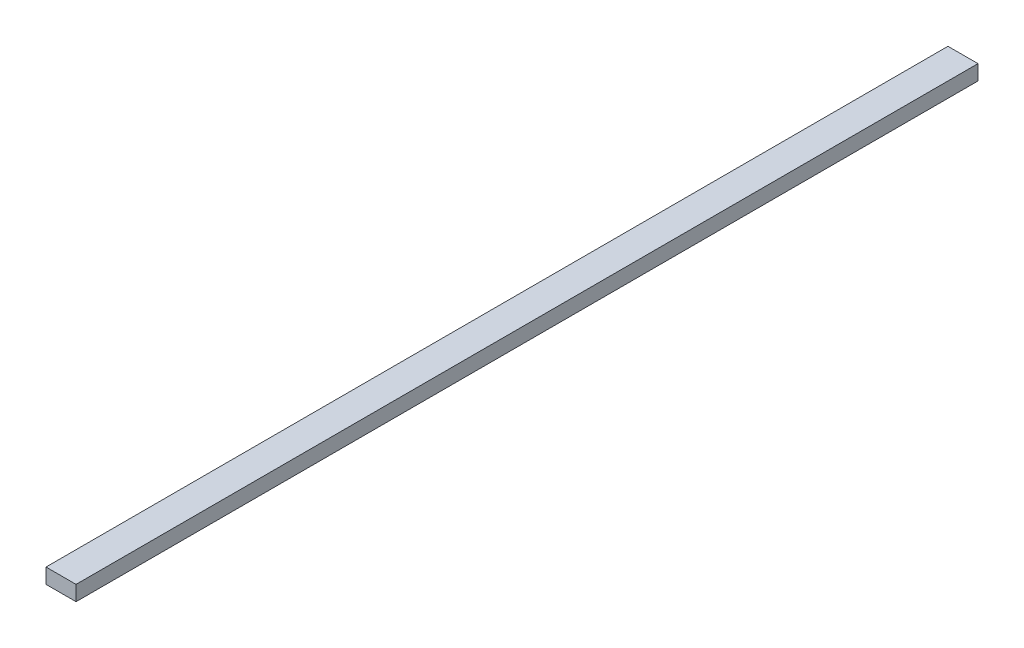
ISO-10303-21;
HEADER;
FILE_DESCRIPTION(('STEP AP214'),'2;1');
FILE_NAME('part.step','',(''),(''),'','','');
FILE_SCHEMA(('AUTOMOTIVE_DESIGN { 1 0 10303 214 1 1 1 1 }'));
ENDSEC;
DATA;
#1=APPLICATION_CONTEXT('core data for automotive mechanical design processes');
#2=APPLICATION_PROTOCOL_DEFINITION('international standard','automotive_design',2000,#1);
#3=PRODUCT_CONTEXT('',#1,'mechanical');
#4=PRODUCT('Part','Part','',(#3));
#5=PRODUCT_RELATED_PRODUCT_CATEGORY('part','',(#4));
#6=PRODUCT_DEFINITION_FORMATION('','',#4);
#7=PRODUCT_DEFINITION_CONTEXT('part definition',#1,'design');
#8=PRODUCT_DEFINITION('design','',#6,#7);
#9=PRODUCT_DEFINITION_SHAPE('','',#8);
#10=(LENGTH_UNIT() NAMED_UNIT(*) SI_UNIT(.MILLI.,.METRE.));
#11=(NAMED_UNIT(*) PLANE_ANGLE_UNIT() SI_UNIT($,.RADIAN.));
#12=(NAMED_UNIT(*) SI_UNIT($,.STERADIAN.) SOLID_ANGLE_UNIT());
#13=UNCERTAINTY_MEASURE_WITH_UNIT(LENGTH_MEASURE(1.E-05),#10,'distance_accuracy_value','');
#14=(GEOMETRIC_REPRESENTATION_CONTEXT(3) GLOBAL_UNCERTAINTY_ASSIGNED_CONTEXT((#13)) GLOBAL_UNIT_ASSIGNED_CONTEXT((#10,
#11,#12)) REPRESENTATION_CONTEXT('',''));
#15=CARTESIAN_POINT('',(0.,0.,0.));
#16=DIRECTION('',(0.,0.,1.));
#17=DIRECTION('',(1.,0.,0.));
#18=AXIS2_PLACEMENT_3D('',#15,#16,#17);
#19=CARTESIAN_POINT('',(9.99179118719586,5.,-65.1031420584252));
#20=DIRECTION('',(-1.,0.,0.));
#21=DIRECTION('',(0.,0.,1.));
#22=AXIS2_PLACEMENT_3D('',#19,#20,#21);
#23=PLANE('',#22);
#24=DIRECTION('',(0.,0.,-1.));
#25=VECTOR('',#24,1.);
#26=CARTESIAN_POINT('',(9.99179118719586,0.,-65.1031420584252));
#27=LINE('',#26,#25);
#28=CARTESIAN_POINT('',(9.99179118719586,0.,234.896857941575));
#29=VERTEX_POINT('',#28);
#30=CARTESIAN_POINT('',(9.99179118719586,0.,-65.1031420584252));
#31=VERTEX_POINT('',#30);
#32=EDGE_CURVE('E96',#29,#31,#27,.T.);
#33=ORIENTED_EDGE('',*,*,#32,.T.);
#34=DIRECTION('',(0.,-1.,0.));
#35=VECTOR('',#34,1.);
#36=CARTESIAN_POINT('',(9.99179118719586,5.,-65.1031420584252));
#37=LINE('',#36,#35);
#38=CARTESIAN_POINT('',(9.99179118719586,5.,-65.1031420584252));
#39=VERTEX_POINT('',#38);
#40=EDGE_CURVE('E11',#39,#31,#37,.T.);
#41=ORIENTED_EDGE('',*,*,#40,.F.);
#42=DIRECTION('',(0.,0.,-1.));
#43=VECTOR('',#42,1.);
#44=CARTESIAN_POINT('',(9.99179118719586,5.,-65.1031420584252));
#45=LINE('',#44,#43);
#46=CARTESIAN_POINT('',(9.99179118719586,5.,234.896857941575));
#47=VERTEX_POINT('',#46);
#48=EDGE_CURVE('E84',#47,#39,#45,.T.);
#49=ORIENTED_EDGE('',*,*,#48,.F.);
#50=DIRECTION('',(0.,-1.,0.));
#51=VECTOR('',#50,1.);
#52=CARTESIAN_POINT('',(9.99179118719586,5.,234.896857941575));
#53=LINE('',#52,#51);
#54=EDGE_CURVE('E92',#47,#29,#53,.T.);
#55=ORIENTED_EDGE('',*,*,#54,.T.);
#56=EDGE_LOOP('',(#33,#41,#49,#55));
#57=FACE_BOUND('',#56,.T.);
#58=ADVANCED_FACE('F33',(#57),#23,.F.);
#59=CARTESIAN_POINT('',(9.99179118719586,5.,-65.1031420584252));
#60=DIRECTION('',(0.,0.,1.));
#61=DIRECTION('',(1.,0.,0.));
#62=AXIS2_PLACEMENT_3D('',#59,#60,#61);
#63=PLANE('',#62);
#64=DIRECTION('',(-1.,0.,0.));
#65=VECTOR('',#64,1.);
#66=CARTESIAN_POINT('',(9.99179118719586,0.,-65.1031420584252));
#67=LINE('',#66,#65);
#68=CARTESIAN_POINT('',(0.,0.,-65.1031420584252));
#69=VERTEX_POINT('',#68);
#70=EDGE_CURVE('E88',#31,#69,#67,.T.);
#71=ORIENTED_EDGE('',*,*,#70,.T.);
#72=DIRECTION('',(0.,-1.,0.));
#73=VECTOR('',#72,1.);
#74=CARTESIAN_POINT('',(0.,5.,-65.1031420584252));
#75=LINE('',#74,#73);
#76=CARTESIAN_POINT('',(0.,5.,-65.1031420584252));
#77=VERTEX_POINT('',#76);
#78=EDGE_CURVE('E41',#77,#69,#75,.T.);
#79=ORIENTED_EDGE('',*,*,#78,.F.);
#80=DIRECTION('',(-1.,0.,0.));
#81=VECTOR('',#80,1.);
#82=CARTESIAN_POINT('',(9.99179118719586,5.,-65.1031420584252));
#83=LINE('',#82,#81);
#84=EDGE_CURVE('E79',#39,#77,#83,.T.);
#85=ORIENTED_EDGE('',*,*,#84,.F.);
#86=ORIENTED_EDGE('',*,*,#40,.T.);
#87=EDGE_LOOP('',(#71,#79,#85,#86));
#88=FACE_BOUND('',#87,.T.);
#89=ADVANCED_FACE('F87',(#88),#63,.F.);
#90=CARTESIAN_POINT('',(0.,5.,-65.1031420584252));
#91=DIRECTION('',(1.,0.,0.));
#92=DIRECTION('',(0.,0.,-1.));
#93=AXIS2_PLACEMENT_3D('',#90,#91,#92);
#94=PLANE('',#93);
#95=DIRECTION('',(0.,0.,1.));
#96=VECTOR('',#95,1.);
#97=CARTESIAN_POINT('',(0.,0.,-65.1031420584252));
#98=LINE('',#97,#96);
#99=CARTESIAN_POINT('',(0.,0.,234.896857941575));
#100=VERTEX_POINT('',#99);
#101=EDGE_CURVE('E66',#69,#100,#98,.T.);
#102=ORIENTED_EDGE('',*,*,#101,.T.);
#103=DIRECTION('',(0.,-1.,0.));
#104=VECTOR('',#103,1.);
#105=CARTESIAN_POINT('',(0.,5.,234.896857941575));
#106=LINE('',#105,#104);
#107=CARTESIAN_POINT('',(0.,5.,234.896857941575));
#108=VERTEX_POINT('',#107);
#109=EDGE_CURVE('E89',#108,#100,#106,.T.);
#110=ORIENTED_EDGE('',*,*,#109,.F.);
#111=DIRECTION('',(0.,0.,1.));
#112=VECTOR('',#111,1.);
#113=CARTESIAN_POINT('',(0.,5.,-65.1031420584252));
#114=LINE('',#113,#112);
#115=EDGE_CURVE('E82',#77,#108,#114,.T.);
#116=ORIENTED_EDGE('',*,*,#115,.F.);
#117=ORIENTED_EDGE('',*,*,#78,.T.);
#118=EDGE_LOOP('',(#102,#110,#116,#117));
#119=FACE_BOUND('',#118,.T.);
#120=ADVANCED_FACE('F90',(#119),#94,.F.);
#121=CARTESIAN_POINT('',(9.99179118719586,5.,234.896857941575));
#122=DIRECTION('',(0.,0.,-1.));
#123=DIRECTION('',(-1.,0.,0.));
#124=AXIS2_PLACEMENT_3D('',#121,#122,#123);
#125=PLANE('',#124);
#126=DIRECTION('',(1.,0.,0.));
#127=VECTOR('',#126,1.);
#128=CARTESIAN_POINT('',(9.99179118719586,0.,234.896857941575));
#129=LINE('',#128,#127);
#130=EDGE_CURVE('E72',#100,#29,#129,.T.);
#131=ORIENTED_EDGE('',*,*,#130,.T.);
#132=ORIENTED_EDGE('',*,*,#54,.F.);
#133=DIRECTION('',(1.,0.,0.));
#134=VECTOR('',#133,1.);
#135=CARTESIAN_POINT('',(9.99179118719586,5.,234.896857941575));
#136=LINE('',#135,#134);
#137=EDGE_CURVE('E49',#108,#47,#136,.T.);
#138=ORIENTED_EDGE('',*,*,#137,.F.);
#139=ORIENTED_EDGE('',*,*,#109,.T.);
#140=EDGE_LOOP('',(#131,#132,#138,#139));
#141=FACE_BOUND('',#140,.T.);
#142=ADVANCED_FACE('F103',(#141),#125,.F.);
#143=CARTESIAN_POINT('',(0.,5.,0.));
#144=DIRECTION('',(0.,-1.,0.));
#145=DIRECTION('',(0.,0.,-1.));
#146=AXIS2_PLACEMENT_3D('',#143,#144,#145);
#147=PLANE('',#146);
#148=ORIENTED_EDGE('',*,*,#48,.T.);
#149=ORIENTED_EDGE('',*,*,#84,.T.);
#150=ORIENTED_EDGE('',*,*,#115,.T.);
#151=ORIENTED_EDGE('',*,*,#137,.T.);
#152=EDGE_LOOP('',(#148,#149,#150,#151));
#153=FACE_BOUND('',#152,.T.);
#154=ADVANCED_FACE('F80',(#153),#147,.F.);
#155=CARTESIAN_POINT('',(0.,0.,0.));
#156=DIRECTION('',(0.,-1.,0.));
#157=DIRECTION('',(0.,0.,-1.));
#158=AXIS2_PLACEMENT_3D('',#155,#156,#157);
#159=PLANE('',#158);
#160=ORIENTED_EDGE('',*,*,#32,.F.);
#161=ORIENTED_EDGE('',*,*,#130,.F.);
#162=ORIENTED_EDGE('',*,*,#101,.F.);
#163=ORIENTED_EDGE('',*,*,#70,.F.);
#164=EDGE_LOOP('',(#160,#161,#162,#163));
#165=FACE_BOUND('',#164,.T.);
#166=ADVANCED_FACE('F106',(#165),#159,.T.);
#167=CLOSED_SHELL('',(#58,#89,#120,#142,#154,#166));
#168=MANIFOLD_SOLID_BREP('B2',#167);
#169=ADVANCED_BREP_SHAPE_REPRESENTATION('',(#18,#168),#14);
#170=SHAPE_DEFINITION_REPRESENTATION(#9,#169);
ENDSEC;
END-ISO-10303-21;
